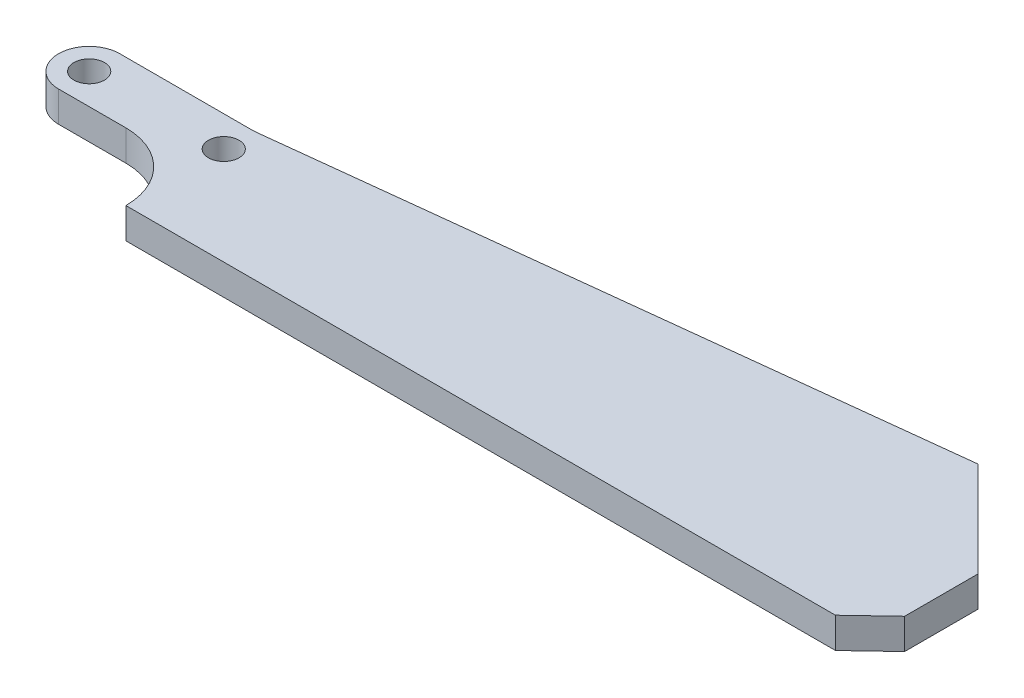
ISO-10303-21;
HEADER;
FILE_DESCRIPTION(('STEP AP214'),'2;1');
FILE_NAME('part.step','',(''),(''),'','','');
FILE_SCHEMA(('AUTOMOTIVE_DESIGN { 1 0 10303 214 1 1 1 1 }'));
ENDSEC;
DATA;
#1=APPLICATION_CONTEXT('core data for automotive mechanical design processes');
#2=APPLICATION_PROTOCOL_DEFINITION('international standard','automotive_design',2000,#1);
#3=PRODUCT_CONTEXT('',#1,'mechanical');
#4=PRODUCT('Part','Part','',(#3));
#5=PRODUCT_RELATED_PRODUCT_CATEGORY('part','',(#4));
#6=PRODUCT_DEFINITION_FORMATION('','',#4);
#7=PRODUCT_DEFINITION_CONTEXT('part definition',#1,'design');
#8=PRODUCT_DEFINITION('design','',#6,#7);
#9=PRODUCT_DEFINITION_SHAPE('','',#8);
#10=(LENGTH_UNIT() NAMED_UNIT(*) SI_UNIT(.MILLI.,.METRE.));
#11=(NAMED_UNIT(*) PLANE_ANGLE_UNIT() SI_UNIT($,.RADIAN.));
#12=(NAMED_UNIT(*) SI_UNIT($,.STERADIAN.) SOLID_ANGLE_UNIT());
#13=UNCERTAINTY_MEASURE_WITH_UNIT(LENGTH_MEASURE(1.E-05),#10,'distance_accuracy_value','');
#14=(GEOMETRIC_REPRESENTATION_CONTEXT(3) GLOBAL_UNCERTAINTY_ASSIGNED_CONTEXT((#13)) GLOBAL_UNIT_ASSIGNED_CONTEXT((#10,
#11,#12)) REPRESENTATION_CONTEXT('',''));
#15=CARTESIAN_POINT('',(0.,0.,0.));
#16=DIRECTION('',(0.,0.,1.));
#17=DIRECTION('',(1.,0.,0.));
#18=AXIS2_PLACEMENT_3D('',#15,#16,#17);
#19=CARTESIAN_POINT('',(-11.,5.,0.));
#20=DIRECTION('',(0.,-1.,0.));
#21=DIRECTION('',(0.,0.,-1.));
#22=AXIS2_PLACEMENT_3D('',#19,#20,#21);
#23=PLANE('',#22);
#24=DIRECTION('',(1.,0.,0.));
#25=VECTOR('',#24,1.);
#26=CARTESIAN_POINT('',(11.,5.,5.));
#27=LINE('',#26,#25);
#28=CARTESIAN_POINT('',(-11.,5.,5.));
#29=VERTEX_POINT('',#28);
#30=CARTESIAN_POINT('',(0.,5.,5.));
#31=VERTEX_POINT('',#30);
#32=EDGE_CURVE('E127',#29,#31,#27,.T.);
#33=ORIENTED_EDGE('',*,*,#32,.T.);
#34=CARTESIAN_POINT('',(0.,5.,16.));
#35=DIRECTION('',(0.,-1.,0.));
#36=DIRECTION('',(0.,0.,-1.));
#37=AXIS2_PLACEMENT_3D('',#34,#35,#36);
#38=CIRCLE('',#37,11.);
#39=CARTESIAN_POINT('',(11.,5.,16.));
#40=VERTEX_POINT('',#39);
#41=EDGE_CURVE('E121',#31,#40,#38,.T.);
#42=ORIENTED_EDGE('',*,*,#41,.T.);
#43=DIRECTION('',(1.,0.,0.));
#44=VECTOR('',#43,1.);
#45=CARTESIAN_POINT('',(11.,5.,16.));
#46=LINE('',#45,#44);
#47=CARTESIAN_POINT('',(127.,5.,16.));
#48=VERTEX_POINT('',#47);
#49=EDGE_CURVE('E124',#40,#48,#46,.T.);
#50=ORIENTED_EDGE('',*,*,#49,.T.);
#51=DIRECTION('',(0.72618437741389,0.,-0.687500000000001));
#52=VECTOR('',#51,1.);
#53=CARTESIAN_POINT('',(127.,5.,16.));
#54=LINE('',#53,#52);
#55=CARTESIAN_POINT('',(132.809475019311,5.,10.5));
#56=VERTEX_POINT('',#55);
#57=EDGE_CURVE('E143',#48,#56,#54,.T.);
#58=ORIENTED_EDGE('',*,*,#57,.T.);
#59=DIRECTION('',(0.,0.,-1.));
#60=VECTOR('',#59,1.);
#61=CARTESIAN_POINT('',(132.809475019311,5.,10.5));
#62=LINE('',#61,#60);
#63=CARTESIAN_POINT('',(132.809475019311,5.,-1.5));
#64=VERTEX_POINT('',#63);
#65=EDGE_CURVE('E217',#56,#64,#62,.T.);
#66=ORIENTED_EDGE('',*,*,#65,.T.);
#67=DIRECTION('',(-0.707106781186551,0.,-0.707106781186544));
#68=VECTOR('',#67,1.);
#69=CARTESIAN_POINT('',(132.809475019311,5.,-1.5));
#70=LINE('',#69,#68);
#71=CARTESIAN_POINT('',(117.253125833207,5.,-17.056349186104));
#72=VERTEX_POINT('',#71);
#73=EDGE_CURVE('E241',#64,#72,#70,.T.);
#74=ORIENTED_EDGE('',*,*,#73,.T.);
#75=DIRECTION('',(-0.993623988521379,0.,0.112744709121388));
#76=VECTOR('',#75,1.);
#77=CARTESIAN_POINT('',(117.253125833207,5.,-17.056349186104));
#78=LINE('',#77,#76);
#79=CARTESIAN_POINT('',(11.6181127084524,5.,-5.07013612626483));
#80=VERTEX_POINT('',#79);
#81=EDGE_CURVE('E238',#72,#80,#78,.T.);
#82=ORIENTED_EDGE('',*,*,#81,.T.);
#83=CARTESIAN_POINT('',(10.3779209081171,5.,-16.));
#84=DIRECTION('',(0.,-1.,0.));
#85=DIRECTION('',(0.,0.,-1.));
#86=AXIS2_PLACEMENT_3D('',#83,#84,#85);
#87=CIRCLE('',#86,11.);
#88=CARTESIAN_POINT('',(10.3779209081171,5.,-5.));
#89=VERTEX_POINT('',#88);
#90=EDGE_CURVE('E11',#80,#89,#87,.T.);
#91=ORIENTED_EDGE('',*,*,#90,.T.);
#92=DIRECTION('',(-1.,0.,0.));
#93=VECTOR('',#92,1.);
#94=CARTESIAN_POINT('',(-11.,5.,-5.));
#95=LINE('',#94,#93);
#96=CARTESIAN_POINT('',(-11.,5.,-5.));
#97=VERTEX_POINT('',#96);
#98=EDGE_CURVE('E172',#89,#97,#95,.T.);
#99=ORIENTED_EDGE('',*,*,#98,.T.);
#100=CARTESIAN_POINT('',(-11.,5.,0.));
#101=DIRECTION('',(0.,1.,0.));
#102=DIRECTION('',(0.,0.,-1.));
#103=AXIS2_PLACEMENT_3D('',#100,#101,#102);
#104=CIRCLE('',#103,5.);
#105=EDGE_CURVE('E233',#97,#29,#104,.T.);
#106=ORIENTED_EDGE('',*,*,#105,.T.);
#107=EDGE_LOOP('',(#33,#42,#50,#58,#66,#74,#82,#91,#99,#106));
#108=FACE_BOUND('',#107,.T.);
#109=CARTESIAN_POINT('',(-11.,5.,0.));
#110=DIRECTION('',(0.,1.,0.));
#111=DIRECTION('',(0.,0.,1.));
#112=AXIS2_PLACEMENT_3D('',#109,#110,#111);
#113=CIRCLE('',#112,2.5);
#114=CARTESIAN_POINT('',(-11.,5.,2.5));
#115=VERTEX_POINT('',#114);
#116=EDGE_CURVE('E230',#115,#115,#113,.T.);
#117=ORIENTED_EDGE('',*,*,#116,.F.);
#118=EDGE_LOOP('',(#117));
#119=FACE_BOUND('',#118,.T.);
#120=CARTESIAN_POINT('',(11.,5.,0.));
#121=DIRECTION('',(0.,1.,0.));
#122=DIRECTION('',(0.,0.,1.));
#123=AXIS2_PLACEMENT_3D('',#120,#121,#122);
#124=CIRCLE('',#123,2.5);
#125=CARTESIAN_POINT('',(11.,5.,2.5));
#126=VERTEX_POINT('',#125);
#127=EDGE_CURVE('E252',#126,#126,#124,.T.);
#128=ORIENTED_EDGE('',*,*,#127,.F.);
#129=EDGE_LOOP('',(#128));
#130=FACE_BOUND('',#129,.T.);
#131=ADVANCED_FACE('F43',(#108,#119,#130),#23,.F.);
#132=CARTESIAN_POINT('',(-11.,0.,0.));
#133=DIRECTION('',(0.,-1.,0.));
#134=DIRECTION('',(0.,0.,-1.));
#135=AXIS2_PLACEMENT_3D('',#132,#133,#134);
#136=PLANE('',#135);
#137=CARTESIAN_POINT('',(-11.,0.,0.));
#138=DIRECTION('',(0.,1.,0.));
#139=DIRECTION('',(0.,0.,1.));
#140=AXIS2_PLACEMENT_3D('',#137,#138,#139);
#141=CIRCLE('',#140,2.5);
#142=CARTESIAN_POINT('',(-11.,0.,2.5));
#143=VERTEX_POINT('',#142);
#144=EDGE_CURVE('E248',#143,#143,#141,.T.);
#145=ORIENTED_EDGE('',*,*,#144,.T.);
#146=EDGE_LOOP('',(#145));
#147=FACE_BOUND('',#146,.T.);
#148=DIRECTION('',(1.,0.,0.));
#149=VECTOR('',#148,1.);
#150=CARTESIAN_POINT('',(119.,0.,16.));
#151=LINE('',#150,#149);
#152=CARTESIAN_POINT('',(11.,0.,16.));
#153=VERTEX_POINT('',#152);
#154=CARTESIAN_POINT('',(127.,0.,16.));
#155=VERTEX_POINT('',#154);
#156=EDGE_CURVE('E225',#153,#155,#151,.T.);
#157=ORIENTED_EDGE('',*,*,#156,.F.);
#158=CARTESIAN_POINT('',(0.,0.,16.));
#159=DIRECTION('',(0.,-1.,0.));
#160=DIRECTION('',(0.,0.,-1.));
#161=AXIS2_PLACEMENT_3D('',#158,#159,#160);
#162=CIRCLE('',#161,11.);
#163=CARTESIAN_POINT('',(0.,0.,5.));
#164=VERTEX_POINT('',#163);
#165=EDGE_CURVE('E133',#153,#164,#162,.F.);
#166=ORIENTED_EDGE('',*,*,#165,.T.);
#167=DIRECTION('',(1.,0.,0.));
#168=VECTOR('',#167,1.);
#169=CARTESIAN_POINT('',(11.,0.,5.));
#170=LINE('',#169,#168);
#171=CARTESIAN_POINT('',(-11.,0.,5.));
#172=VERTEX_POINT('',#171);
#173=EDGE_CURVE('E144',#172,#164,#170,.T.);
#174=ORIENTED_EDGE('',*,*,#173,.F.);
#175=CARTESIAN_POINT('',(-11.,0.,0.));
#176=DIRECTION('',(0.,1.,0.));
#177=DIRECTION('',(0.,0.,-1.));
#178=AXIS2_PLACEMENT_3D('',#175,#176,#177);
#179=CIRCLE('',#178,5.);
#180=CARTESIAN_POINT('',(-11.,0.,-5.));
#181=VERTEX_POINT('',#180);
#182=EDGE_CURVE('E179',#181,#172,#179,.T.);
#183=ORIENTED_EDGE('',*,*,#182,.F.);
#184=DIRECTION('',(-1.,0.,0.));
#185=VECTOR('',#184,1.);
#186=CARTESIAN_POINT('',(-11.,0.,-5.));
#187=LINE('',#186,#185);
#188=CARTESIAN_POINT('',(10.3779209081171,0.,-5.));
#189=VERTEX_POINT('',#188);
#190=EDGE_CURVE('E170',#189,#181,#187,.T.);
#191=ORIENTED_EDGE('',*,*,#190,.F.);
#192=CARTESIAN_POINT('',(10.3779209081171,0.,-16.));
#193=DIRECTION('',(0.,-1.,0.));
#194=DIRECTION('',(0.,0.,-1.));
#195=AXIS2_PLACEMENT_3D('',#192,#193,#194);
#196=CIRCLE('',#195,11.);
#197=CARTESIAN_POINT('',(11.6181127084524,0.,-5.07013612626483));
#198=VERTEX_POINT('',#197);
#199=EDGE_CURVE('E52',#189,#198,#196,.F.);
#200=ORIENTED_EDGE('',*,*,#199,.T.);
#201=DIRECTION('',(-0.993623988521379,0.,0.112744709121388));
#202=VECTOR('',#201,1.);
#203=CARTESIAN_POINT('',(117.253125833207,0.,-17.056349186104));
#204=LINE('',#203,#202);
#205=CARTESIAN_POINT('',(117.253125833207,0.,-17.056349186104));
#206=VERTEX_POINT('',#205);
#207=EDGE_CURVE('E181',#206,#198,#204,.T.);
#208=ORIENTED_EDGE('',*,*,#207,.F.);
#209=DIRECTION('',(-0.707106781186551,0.,-0.707106781186544));
#210=VECTOR('',#209,1.);
#211=CARTESIAN_POINT('',(120.081552957953,0.,-14.2279220613578));
#212=LINE('',#211,#210);
#213=CARTESIAN_POINT('',(132.809475019311,0.,-1.5));
#214=VERTEX_POINT('',#213);
#215=EDGE_CURVE('E186',#214,#206,#212,.T.);
#216=ORIENTED_EDGE('',*,*,#215,.F.);
#217=DIRECTION('',(0.,0.,-1.));
#218=VECTOR('',#217,1.);
#219=CARTESIAN_POINT('',(132.809475019311,0.,10.5));
#220=LINE('',#219,#218);
#221=CARTESIAN_POINT('',(132.809475019311,0.,10.5));
#222=VERTEX_POINT('',#221);
#223=EDGE_CURVE('E216',#222,#214,#220,.T.);
#224=ORIENTED_EDGE('',*,*,#223,.F.);
#225=DIRECTION('',(0.72618437741389,0.,-0.687500000000001));
#226=VECTOR('',#225,1.);
#227=CARTESIAN_POINT('',(127.,0.,16.));
#228=LINE('',#227,#226);
#229=EDGE_CURVE('E220',#155,#222,#228,.T.);
#230=ORIENTED_EDGE('',*,*,#229,.F.);
#231=EDGE_LOOP('',(#157,#166,#174,#183,#191,#200,#208,#216,#224,#230));
#232=FACE_BOUND('',#231,.T.);
#233=CARTESIAN_POINT('',(11.,0.,0.));
#234=DIRECTION('',(0.,1.,0.));
#235=DIRECTION('',(0.,0.,1.));
#236=AXIS2_PLACEMENT_3D('',#233,#234,#235);
#237=CIRCLE('',#236,2.5);
#238=CARTESIAN_POINT('',(11.,0.,2.5));
#239=VERTEX_POINT('',#238);
#240=EDGE_CURVE('E256',#239,#239,#237,.T.);
#241=ORIENTED_EDGE('',*,*,#240,.T.);
#242=EDGE_LOOP('',(#241));
#243=FACE_BOUND('',#242,.T.);
#244=ADVANCED_FACE('F176',(#147,#232,#243),#136,.T.);
#245=CARTESIAN_POINT('',(119.,5.,16.));
#246=DIRECTION('',(0.,0.,-1.));
#247=DIRECTION('',(-1.,0.,0.));
#248=AXIS2_PLACEMENT_3D('',#245,#246,#247);
#249=PLANE('',#248);
#250=ORIENTED_EDGE('',*,*,#156,.T.);
#251=DIRECTION('',(0.,-1.,0.));
#252=VECTOR('',#251,1.);
#253=CARTESIAN_POINT('',(127.,5.,16.));
#254=LINE('',#253,#252);
#255=EDGE_CURVE('E140',#48,#155,#254,.T.);
#256=ORIENTED_EDGE('',*,*,#255,.F.);
#257=ORIENTED_EDGE('',*,*,#49,.F.);
#258=DIRECTION('',(0.,-1.,0.));
#259=VECTOR('',#258,1.);
#260=CARTESIAN_POINT('',(11.,5.,16.));
#261=LINE('',#260,#259);
#262=EDGE_CURVE('E138',#40,#153,#261,.T.);
#263=ORIENTED_EDGE('',*,*,#262,.T.);
#264=EDGE_LOOP('',(#250,#256,#257,#263));
#265=FACE_BOUND('',#264,.T.);
#266=ADVANCED_FACE('F137',(#265),#249,.F.);
#267=CARTESIAN_POINT('',(127.,5.,16.));
#268=DIRECTION('',(-0.687500000000001,0.,-0.72618437741389));
#269=DIRECTION('',(-0.72618437741389,0.,0.687500000000001));
#270=AXIS2_PLACEMENT_3D('',#267,#268,#269);
#271=PLANE('',#270);
#272=ORIENTED_EDGE('',*,*,#229,.T.);
#273=DIRECTION('',(0.,-1.,0.));
#274=VECTOR('',#273,1.);
#275=CARTESIAN_POINT('',(132.809475019311,5.,10.5));
#276=LINE('',#275,#274);
#277=EDGE_CURVE('E154',#56,#222,#276,.T.);
#278=ORIENTED_EDGE('',*,*,#277,.F.);
#279=ORIENTED_EDGE('',*,*,#57,.F.);
#280=ORIENTED_EDGE('',*,*,#255,.T.);
#281=EDGE_LOOP('',(#272,#278,#279,#280));
#282=FACE_BOUND('',#281,.T.);
#283=ADVANCED_FACE('F297',(#282),#271,.F.);
#284=CARTESIAN_POINT('',(132.809475019311,5.,10.5));
#285=DIRECTION('',(-1.,0.,0.));
#286=DIRECTION('',(0.,0.,1.));
#287=AXIS2_PLACEMENT_3D('',#284,#285,#286);
#288=PLANE('',#287);
#289=ORIENTED_EDGE('',*,*,#223,.T.);
#290=DIRECTION('',(0.,-1.,0.));
#291=VECTOR('',#290,1.);
#292=CARTESIAN_POINT('',(132.809475019311,5.,-1.5));
#293=LINE('',#292,#291);
#294=EDGE_CURVE('E204',#64,#214,#293,.T.);
#295=ORIENTED_EDGE('',*,*,#294,.F.);
#296=ORIENTED_EDGE('',*,*,#65,.F.);
#297=ORIENTED_EDGE('',*,*,#277,.T.);
#298=EDGE_LOOP('',(#289,#295,#296,#297));
#299=FACE_BOUND('',#298,.T.);
#300=ADVANCED_FACE('F214',(#299),#288,.F.);
#301=CARTESIAN_POINT('',(120.081552957953,5.,-14.2279220613578));
#302=DIRECTION('',(-0.707106781186544,0.,0.707106781186551));
#303=DIRECTION('',(0.707106781186551,0.,0.707106781186544));
#304=AXIS2_PLACEMENT_3D('',#301,#302,#303);
#305=PLANE('',#304);
#306=ORIENTED_EDGE('',*,*,#215,.T.);
#307=DIRECTION('',(0.,-1.,0.));
#308=VECTOR('',#307,1.);
#309=CARTESIAN_POINT('',(117.253125833207,5.,-17.056349186104));
#310=LINE('',#309,#308);
#311=EDGE_CURVE('E200',#72,#206,#310,.T.);
#312=ORIENTED_EDGE('',*,*,#311,.F.);
#313=ORIENTED_EDGE('',*,*,#73,.F.);
#314=ORIENTED_EDGE('',*,*,#294,.T.);
#315=EDGE_LOOP('',(#306,#312,#313,#314));
#316=FACE_BOUND('',#315,.T.);
#317=ADVANCED_FACE('F291',(#316),#305,.F.);
#318=CARTESIAN_POINT('',(117.253125833207,5.,-17.056349186104));
#319=DIRECTION('',(0.112744709121388,0.,0.993623988521379));
#320=DIRECTION('',(0.993623988521379,0.,-0.112744709121388));
#321=AXIS2_PLACEMENT_3D('',#318,#319,#320);
#322=PLANE('',#321);
#323=ORIENTED_EDGE('',*,*,#207,.T.);
#324=DIRECTION('',(0.,-1.,0.));
#325=VECTOR('',#324,1.);
#326=CARTESIAN_POINT('',(11.6181127084524,5.,-5.07013612626483));
#327=LINE('',#326,#325);
#328=EDGE_CURVE('E59',#198,#80,#327,.F.);
#329=ORIENTED_EDGE('',*,*,#328,.T.);
#330=ORIENTED_EDGE('',*,*,#81,.F.);
#331=ORIENTED_EDGE('',*,*,#311,.T.);
#332=EDGE_LOOP('',(#323,#329,#330,#331));
#333=FACE_BOUND('',#332,.T.);
#334=ADVANCED_FACE('F288',(#333),#322,.F.);
#335=CARTESIAN_POINT('',(-11.,5.,-5.));
#336=DIRECTION('',(0.,0.,1.));
#337=DIRECTION('',(1.,0.,0.));
#338=AXIS2_PLACEMENT_3D('',#335,#336,#337);
#339=PLANE('',#338);
#340=ORIENTED_EDGE('',*,*,#98,.F.);
#341=DIRECTION('',(0.,-1.,0.));
#342=VECTOR('',#341,1.);
#343=CARTESIAN_POINT('',(10.3779209081171,0.,-5.));
#344=LINE('',#343,#342);
#345=EDGE_CURVE('E132',#89,#189,#344,.T.);
#346=ORIENTED_EDGE('',*,*,#345,.T.);
#347=ORIENTED_EDGE('',*,*,#190,.T.);
#348=DIRECTION('',(0.,-1.,0.));
#349=VECTOR('',#348,1.);
#350=CARTESIAN_POINT('',(-11.,5.,-5.));
#351=LINE('',#350,#349);
#352=EDGE_CURVE('E197',#97,#181,#351,.T.);
#353=ORIENTED_EDGE('',*,*,#352,.F.);
#354=EDGE_LOOP('',(#340,#346,#347,#353));
#355=FACE_BOUND('',#354,.T.);
#356=ADVANCED_FACE('F168',(#355),#339,.F.);
#357=CARTESIAN_POINT('',(-11.,5.,0.));
#358=DIRECTION('',(0.,-1.,0.));
#359=DIRECTION('',(0.,0.,-1.));
#360=AXIS2_PLACEMENT_3D('',#357,#358,#359);
#361=CYLINDRICAL_SURFACE('',#360,5.);
#362=ORIENTED_EDGE('',*,*,#182,.T.);
#363=DIRECTION('',(0.,-1.,0.));
#364=VECTOR('',#363,1.);
#365=CARTESIAN_POINT('',(-11.,5.,5.));
#366=LINE('',#365,#364);
#367=EDGE_CURVE('E193',#29,#172,#366,.T.);
#368=ORIENTED_EDGE('',*,*,#367,.F.);
#369=ORIENTED_EDGE('',*,*,#105,.F.);
#370=ORIENTED_EDGE('',*,*,#352,.T.);
#371=EDGE_LOOP('',(#362,#368,#369,#370));
#372=FACE_BOUND('',#371,.T.);
#373=ADVANCED_FACE('F281',(#372),#361,.T.);
#374=CARTESIAN_POINT('',(11.,5.,5.));
#375=DIRECTION('',(0.,0.,-1.));
#376=DIRECTION('',(-1.,0.,0.));
#377=AXIS2_PLACEMENT_3D('',#374,#375,#376);
#378=PLANE('',#377);
#379=ORIENTED_EDGE('',*,*,#173,.T.);
#380=DIRECTION('',(0.,-1.,0.));
#381=VECTOR('',#380,1.);
#382=CARTESIAN_POINT('',(0.,5.,5.));
#383=LINE('',#382,#381);
#384=EDGE_CURVE('E149',#164,#31,#383,.F.);
#385=ORIENTED_EDGE('',*,*,#384,.T.);
#386=ORIENTED_EDGE('',*,*,#32,.F.);
#387=ORIENTED_EDGE('',*,*,#367,.T.);
#388=EDGE_LOOP('',(#379,#385,#386,#387));
#389=FACE_BOUND('',#388,.T.);
#390=ADVANCED_FACE('F278',(#389),#378,.F.);
#391=CARTESIAN_POINT('',(-11.,5.,0.));
#392=DIRECTION('',(0.,-1.,0.));
#393=DIRECTION('',(0.,0.,-1.));
#394=AXIS2_PLACEMENT_3D('',#391,#392,#393);
#395=CYLINDRICAL_SURFACE('',#394,2.5);
#396=ORIENTED_EDGE('',*,*,#116,.T.);
#397=EDGE_LOOP('',(#396));
#398=FACE_BOUND('',#397,.T.);
#399=ORIENTED_EDGE('',*,*,#144,.F.);
#400=EDGE_LOOP('',(#399));
#401=FACE_BOUND('',#400,.T.);
#402=ADVANCED_FACE('F275',(#398,#401),#395,.F.);
#403=CARTESIAN_POINT('',(11.,5.,0.));
#404=DIRECTION('',(0.,-1.,0.));
#405=DIRECTION('',(0.,0.,-1.));
#406=AXIS2_PLACEMENT_3D('',#403,#404,#405);
#407=CYLINDRICAL_SURFACE('',#406,2.5);
#408=ORIENTED_EDGE('',*,*,#127,.T.);
#409=EDGE_LOOP('',(#408));
#410=FACE_BOUND('',#409,.T.);
#411=ORIENTED_EDGE('',*,*,#240,.F.);
#412=EDGE_LOOP('',(#411));
#413=FACE_BOUND('',#412,.T.);
#414=ADVANCED_FACE('F264',(#410,#413),#407,.F.);
#415=CARTESIAN_POINT('',(0.,5.,16.));
#416=DIRECTION('',(0.,1.,0.));
#417=DIRECTION('',(0.,0.,1.));
#418=AXIS2_PLACEMENT_3D('',#415,#416,#417);
#419=CYLINDRICAL_SURFACE('',#418,11.);
#420=ORIENTED_EDGE('',*,*,#41,.F.);
#421=ORIENTED_EDGE('',*,*,#384,.F.);
#422=ORIENTED_EDGE('',*,*,#165,.F.);
#423=ORIENTED_EDGE('',*,*,#262,.F.);
#424=EDGE_LOOP('',(#420,#421,#422,#423));
#425=FACE_BOUND('',#424,.T.);
#426=ADVANCED_FACE('F146',(#425),#419,.F.);
#427=CARTESIAN_POINT('',(10.3779209081171,5.,-16.));
#428=DIRECTION('',(0.,1.,0.));
#429=DIRECTION('',(0.,0.,1.));
#430=AXIS2_PLACEMENT_3D('',#427,#428,#429);
#431=CYLINDRICAL_SURFACE('',#430,11.);
#432=ORIENTED_EDGE('',*,*,#90,.F.);
#433=ORIENTED_EDGE('',*,*,#328,.F.);
#434=ORIENTED_EDGE('',*,*,#199,.F.);
#435=ORIENTED_EDGE('',*,*,#345,.F.);
#436=EDGE_LOOP('',(#432,#433,#434,#435));
#437=FACE_BOUND('',#436,.T.);
#438=ADVANCED_FACE('F45',(#437),#431,.F.);
#439=CLOSED_SHELL('',(#131,#244,#266,#283,#300,#317,#334,#356,#373,#390,#402,#414,#426,#438));
#440=MANIFOLD_SOLID_BREP('B2',#439);
#441=ADVANCED_BREP_SHAPE_REPRESENTATION('',(#18,#440),#14);
#442=SHAPE_DEFINITION_REPRESENTATION(#9,#441);
ENDSEC;
END-ISO-10303-21;
